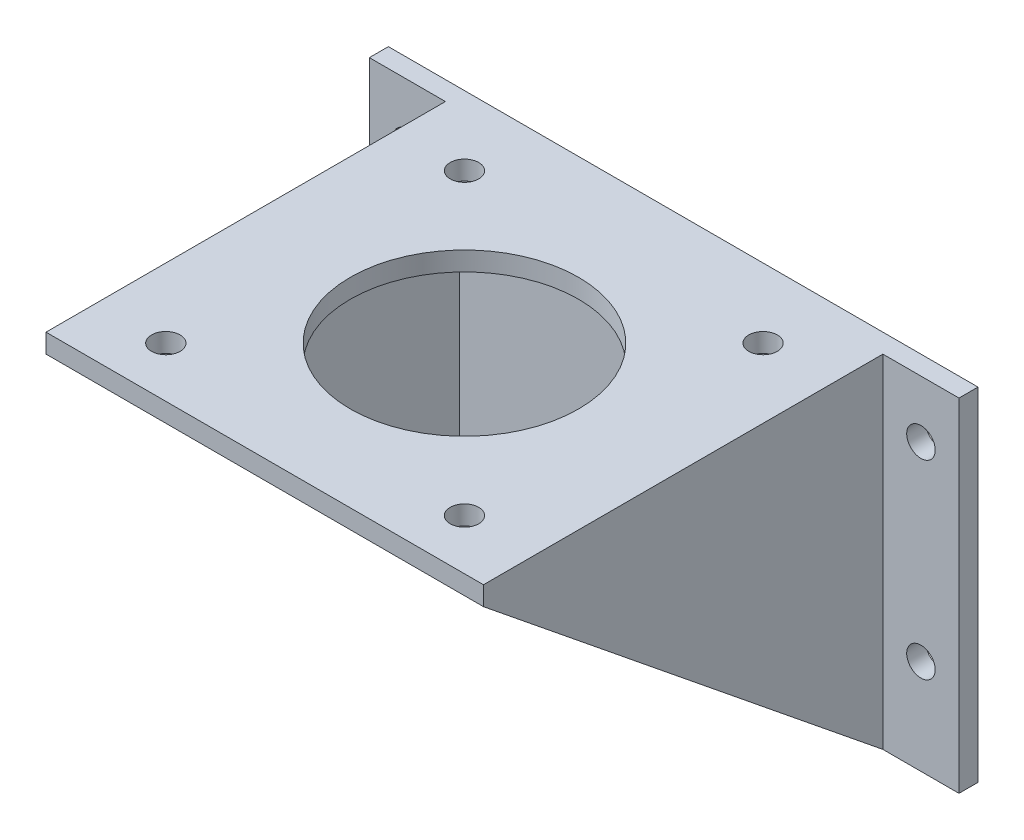
ISO-10303-21;
HEADER;
FILE_DESCRIPTION(('STEP AP214'),'2;1');
FILE_NAME('part.step','',(''),(''),'','','');
FILE_SCHEMA(('AUTOMOTIVE_DESIGN { 1 0 10303 214 1 1 1 1 }'));
ENDSEC;
DATA;
#1=APPLICATION_CONTEXT('core data for automotive mechanical design processes');
#2=APPLICATION_PROTOCOL_DEFINITION('international standard','automotive_design',2000,#1);
#3=PRODUCT_CONTEXT('',#1,'mechanical');
#4=PRODUCT('Part','Part','',(#3));
#5=PRODUCT_RELATED_PRODUCT_CATEGORY('part','',(#4));
#6=PRODUCT_DEFINITION_FORMATION('','',#4);
#7=PRODUCT_DEFINITION_CONTEXT('part definition',#1,'design');
#8=PRODUCT_DEFINITION('design','',#6,#7);
#9=PRODUCT_DEFINITION_SHAPE('','',#8);
#10=(LENGTH_UNIT() NAMED_UNIT(*) SI_UNIT(.MILLI.,.METRE.));
#11=(NAMED_UNIT(*) PLANE_ANGLE_UNIT() SI_UNIT($,.RADIAN.));
#12=(NAMED_UNIT(*) SI_UNIT($,.STERADIAN.) SOLID_ANGLE_UNIT());
#13=UNCERTAINTY_MEASURE_WITH_UNIT(LENGTH_MEASURE(1.E-05),#10,'distance_accuracy_value','');
#14=(GEOMETRIC_REPRESENTATION_CONTEXT(3) GLOBAL_UNCERTAINTY_ASSIGNED_CONTEXT((#13)) GLOBAL_UNIT_ASSIGNED_CONTEXT((#10,
#11,#12)) REPRESENTATION_CONTEXT('',''));
#15=CARTESIAN_POINT('',(0.,0.,0.));
#16=DIRECTION('',(0.,0.,1.));
#17=DIRECTION('',(1.,0.,0.));
#18=AXIS2_PLACEMENT_3D('',#15,#16,#17);
#19=CARTESIAN_POINT('',(0.,0.,2.));
#20=DIRECTION('',(0.,0.,1.));
#21=DIRECTION('',(1.,0.,0.));
#22=AXIS2_PLACEMENT_3D('',#19,#20,#21);
#23=PLANE('',#22);
#24=CARTESIAN_POINT('',(27.,14.,2.));
#25=DIRECTION('',(0.,0.,1.));
#26=DIRECTION('',(1.,0.,0.));
#27=AXIS2_PLACEMENT_3D('',#24,#25,#26);
#28=CIRCLE('',#27,1.5);
#29=CARTESIAN_POINT('',(28.5,14.,2.));
#30=VERTEX_POINT('',#29);
#31=EDGE_CURVE('P0_E10',#30,#30,#28,.T.);
#32=ORIENTED_EDGE('',*,*,#31,.F.);
#33=EDGE_LOOP('',(#32));
#34=FACE_BOUND('',#33,.T.);
#35=CARTESIAN_POINT('',(27.,-6.000008,2.));
#36=DIRECTION('',(0.,0.,1.));
#37=DIRECTION('',(1.,0.,0.));
#38=AXIS2_PLACEMENT_3D('',#35,#36,#37);
#39=CIRCLE('',#38,1.5);
#40=CARTESIAN_POINT('',(28.5,-6.000008,2.));
#41=VERTEX_POINT('',#40);
#42=EDGE_CURVE('P0_E24',#41,#41,#39,.T.);
#43=ORIENTED_EDGE('',*,*,#42,.F.);
#44=EDGE_LOOP('',(#43));
#45=FACE_BOUND('',#44,.T.);
#46=DIRECTION('',(0.,1.,0.));
#47=VECTOR('',#46,1.);
#48=CARTESIAN_POINT('',(23.,19.,2.));
#49=LINE('',#48,#47);
#50=CARTESIAN_POINT('',(23.,-16.000008,2.));
#51=VERTEX_POINT('',#50);
#52=CARTESIAN_POINT('',(23.,20.,2.));
#53=VERTEX_POINT('',#52);
#54=EDGE_CURVE('P0_E31',#51,#53,#49,.T.);
#55=ORIENTED_EDGE('',*,*,#54,.F.);
#56=DIRECTION('',(-1.,0.,0.));
#57=VECTOR('',#56,1.);
#58=CARTESIAN_POINT('',(0.,-16.000008,2.));
#59=LINE('',#58,#57);
#60=CARTESIAN_POINT('',(31.,-16.000008,2.));
#61=VERTEX_POINT('',#60);
#62=EDGE_CURVE('P0_E36',#61,#51,#59,.T.);
#63=ORIENTED_EDGE('',*,*,#62,.F.);
#64=DIRECTION('',(0.,-1.,0.));
#65=VECTOR('',#64,1.);
#66=CARTESIAN_POINT('',(31.,0.,2.));
#67=LINE('',#66,#65);
#68=CARTESIAN_POINT('',(31.,20.,2.));
#69=VERTEX_POINT('',#68);
#70=EDGE_CURVE('P0_E231',#69,#61,#67,.T.);
#71=ORIENTED_EDGE('',*,*,#70,.F.);
#72=DIRECTION('',(-1.,0.,0.));
#73=VECTOR('',#72,1.);
#74=CARTESIAN_POINT('',(0.,20.,2.));
#75=LINE('',#74,#73);
#76=EDGE_CURVE('P0_E228',#69,#53,#75,.T.);
#77=ORIENTED_EDGE('',*,*,#76,.T.);
#78=EDGE_LOOP('',(#55,#63,#71,#77));
#79=FACE_BOUND('',#78,.T.);
#80=ADVANCED_FACE('P0_F16',(#34,#45,#79),#23,.T.);
#81=CARTESIAN_POINT('',(0.,18.,44.));
#82=DIRECTION('',(0.,1.,0.));
#83=DIRECTION('',(-1.,0.,0.));
#84=AXIS2_PLACEMENT_3D('',#81,#82,#83);
#85=PLANE('',#84);
#86=CARTESIAN_POINT('',(0.,18.,23.));
#87=DIRECTION('',(0.,-1.,0.));
#88=DIRECTION('',(1.,0.,0.));
#89=AXIS2_PLACEMENT_3D('',#86,#87,#88);
#90=CIRCLE('',#89,12.);
#91=CARTESIAN_POINT('',(12.,18.,23.));
#92=VERTEX_POINT('',#91);
#93=EDGE_CURVE('P0_E225',#92,#92,#90,.T.);
#94=ORIENTED_EDGE('',*,*,#93,.F.);
#95=EDGE_LOOP('',(#94));
#96=FACE_BOUND('',#95,.T.);
#97=CARTESIAN_POINT('',(15.7,18.,38.7));
#98=DIRECTION('',(0.,-1.,0.));
#99=DIRECTION('',(1.,0.,0.));
#100=AXIS2_PLACEMENT_3D('',#97,#98,#99);
#101=CIRCLE('',#100,1.5);
#102=CARTESIAN_POINT('',(17.2,18.,38.7));
#103=VERTEX_POINT('',#102);
#104=EDGE_CURVE('P0_E222',#103,#103,#101,.T.);
#105=ORIENTED_EDGE('',*,*,#104,.F.);
#106=EDGE_LOOP('',(#105));
#107=FACE_BOUND('',#106,.T.);
#108=CARTESIAN_POINT('',(-15.7,18.,38.7));
#109=DIRECTION('',(0.,-1.,0.));
#110=DIRECTION('',(1.,0.,0.));
#111=AXIS2_PLACEMENT_3D('',#108,#109,#110);
#112=CIRCLE('',#111,1.5);
#113=CARTESIAN_POINT('',(-14.2,18.,38.7));
#114=VERTEX_POINT('',#113);
#115=EDGE_CURVE('P0_E219',#114,#114,#112,.T.);
#116=ORIENTED_EDGE('',*,*,#115,.F.);
#117=EDGE_LOOP('',(#116));
#118=FACE_BOUND('',#117,.T.);
#119=CARTESIAN_POINT('',(-15.7,18.,7.3));
#120=DIRECTION('',(0.,-1.,0.));
#121=DIRECTION('',(1.,0.,0.));
#122=AXIS2_PLACEMENT_3D('',#119,#120,#121);
#123=CIRCLE('',#122,1.5);
#124=CARTESIAN_POINT('',(-14.2,18.,7.3));
#125=VERTEX_POINT('',#124);
#126=EDGE_CURVE('P0_E216',#125,#125,#123,.T.);
#127=ORIENTED_EDGE('',*,*,#126,.F.);
#128=EDGE_LOOP('',(#127));
#129=FACE_BOUND('',#128,.T.);
#130=CARTESIAN_POINT('',(15.7,18.,7.3));
#131=DIRECTION('',(0.,-1.,0.));
#132=DIRECTION('',(1.,0.,0.));
#133=AXIS2_PLACEMENT_3D('',#130,#131,#132);
#134=CIRCLE('',#133,1.5);
#135=CARTESIAN_POINT('',(17.2,18.,7.3));
#136=VERTEX_POINT('',#135);
#137=EDGE_CURVE('P0_E213',#136,#136,#134,.T.);
#138=ORIENTED_EDGE('',*,*,#137,.F.);
#139=EDGE_LOOP('',(#138));
#140=FACE_BOUND('',#139,.T.);
#141=DIRECTION('',(0.,0.,-1.));
#142=VECTOR('',#141,1.);
#143=CARTESIAN_POINT('',(21.5,18.,44.));
#144=LINE('',#143,#142);
#145=CARTESIAN_POINT('',(21.5,18.,44.));
#146=VERTEX_POINT('',#145);
#147=CARTESIAN_POINT('',(21.5,18.,2.));
#148=VERTEX_POINT('',#147);
#149=EDGE_CURVE('P0_E210',#146,#148,#144,.T.);
#150=ORIENTED_EDGE('',*,*,#149,.F.);
#151=DIRECTION('',(1.,0.,0.));
#152=VECTOR('',#151,1.);
#153=CARTESIAN_POINT('',(0.,18.,44.));
#154=LINE('',#153,#152);
#155=CARTESIAN_POINT('',(-21.5,18.,44.));
#156=VERTEX_POINT('',#155);
#157=EDGE_CURVE('P0_E114',#156,#146,#154,.T.);
#158=ORIENTED_EDGE('',*,*,#157,.F.);
#159=DIRECTION('',(0.,0.,-1.));
#160=VECTOR('',#159,1.);
#161=CARTESIAN_POINT('',(-21.5,18.,44.));
#162=LINE('',#161,#160);
#163=CARTESIAN_POINT('',(-21.5,18.,2.));
#164=VERTEX_POINT('',#163);
#165=EDGE_CURVE('P0_E208',#156,#164,#162,.T.);
#166=ORIENTED_EDGE('',*,*,#165,.T.);
#167=DIRECTION('',(1.,0.,0.));
#168=VECTOR('',#167,1.);
#169=CARTESIAN_POINT('',(0.,18.,2.));
#170=LINE('',#169,#168);
#171=EDGE_CURVE('P0_E206',#164,#148,#170,.T.);
#172=ORIENTED_EDGE('',*,*,#171,.T.);
#173=EDGE_LOOP('',(#150,#158,#166,#172));
#174=FACE_BOUND('',#173,.T.);
#175=ADVANCED_FACE('P0_F242',(#96,#107,#118,#129,#140,#174),#85,.F.);
#176=DIRECTION('',(0.,-1.,0.));
#177=VECTOR('',#176,1.);
#178=CARTESIAN_POINT('',(21.5,0.999996,2.));
#179=LINE('',#178,#177);
#180=CARTESIAN_POINT('',(21.5,-16.000008,2.));
#181=VERTEX_POINT('',#180);
#182=EDGE_CURVE('P0_E203',#148,#181,#179,.T.);
#183=ORIENTED_EDGE('',*,*,#182,.F.);
#184=ORIENTED_EDGE('',*,*,#171,.F.);
#185=DIRECTION('',(0.,-1.,0.));
#186=VECTOR('',#185,1.);
#187=CARTESIAN_POINT('',(-21.5,0.999996,2.));
#188=LINE('',#187,#186);
#189=CARTESIAN_POINT('',(-21.5,-16.000008,2.));
#190=VERTEX_POINT('',#189);
#191=EDGE_CURVE('P0_E201',#164,#190,#188,.T.);
#192=ORIENTED_EDGE('',*,*,#191,.T.);
#193=EDGE_CURVE('P0_E200',#181,#190,#59,.T.);
#194=ORIENTED_EDGE('',*,*,#193,.F.);
#195=EDGE_LOOP('',(#183,#184,#192,#194));
#196=FACE_BOUND('',#195,.T.);
#197=ADVANCED_FACE('P0_F244',(#196),#23,.T.);
#198=CARTESIAN_POINT('',(31.,0.,2.));
#199=DIRECTION('',(1.,0.,0.));
#200=DIRECTION('',(0.,1.,0.));
#201=AXIS2_PLACEMENT_3D('',#198,#199,#200);
#202=PLANE('',#201);
#203=ORIENTED_EDGE('',*,*,#70,.T.);
#204=DIRECTION('',(0.,0.,-1.));
#205=VECTOR('',#204,1.);
#206=CARTESIAN_POINT('',(31.,-16.000008,2.));
#207=LINE('',#206,#205);
#208=CARTESIAN_POINT('',(31.,-16.000008,0.));
#209=VERTEX_POINT('',#208);
#210=EDGE_CURVE('P0_E198',#61,#209,#207,.T.);
#211=ORIENTED_EDGE('',*,*,#210,.T.);
#212=DIRECTION('',(0.,-1.,0.));
#213=VECTOR('',#212,1.);
#214=CARTESIAN_POINT('',(31.,0.,0.));
#215=LINE('',#214,#213);
#216=CARTESIAN_POINT('',(31.,20.,0.));
#217=VERTEX_POINT('',#216);
#218=EDGE_CURVE('P0_E195',#217,#209,#215,.T.);
#219=ORIENTED_EDGE('',*,*,#218,.F.);
#220=DIRECTION('',(0.,0.,-1.));
#221=VECTOR('',#220,1.);
#222=CARTESIAN_POINT('',(31.,20.,2.));
#223=LINE('',#222,#221);
#224=EDGE_CURVE('P0_E192',#69,#217,#223,.T.);
#225=ORIENTED_EDGE('',*,*,#224,.F.);
#226=EDGE_LOOP('',(#203,#211,#219,#225));
#227=FACE_BOUND('',#226,.T.);
#228=ADVANCED_FACE('P0_F252',(#227),#202,.T.);
#229=CARTESIAN_POINT('',(-31.,0.,2.));
#230=DIRECTION('',(1.,0.,0.));
#231=DIRECTION('',(0.,1.,0.));
#232=AXIS2_PLACEMENT_3D('',#229,#230,#231);
#233=PLANE('',#232);
#234=DIRECTION('',(0.,0.,-1.));
#235=VECTOR('',#234,1.);
#236=CARTESIAN_POINT('',(-31.,-16.000008,2.));
#237=LINE('',#236,#235);
#238=CARTESIAN_POINT('',(-31.,-16.000008,2.));
#239=VERTEX_POINT('',#238);
#240=CARTESIAN_POINT('',(-31.,-16.000008,0.));
#241=VERTEX_POINT('',#240);
#242=EDGE_CURVE('P0_E189',#239,#241,#237,.T.);
#243=ORIENTED_EDGE('',*,*,#242,.F.);
#244=DIRECTION('',(0.,-1.,0.));
#245=VECTOR('',#244,1.);
#246=CARTESIAN_POINT('',(-31.,0.,2.));
#247=LINE('',#246,#245);
#248=CARTESIAN_POINT('',(-31.,20.,2.));
#249=VERTEX_POINT('',#248);
#250=EDGE_CURVE('P0_E186',#249,#239,#247,.T.);
#251=ORIENTED_EDGE('',*,*,#250,.F.);
#252=DIRECTION('',(0.,0.,-1.));
#253=VECTOR('',#252,1.);
#254=CARTESIAN_POINT('',(-31.,20.,2.));
#255=LINE('',#254,#253);
#256=CARTESIAN_POINT('',(-31.,20.,0.));
#257=VERTEX_POINT('',#256);
#258=EDGE_CURVE('P0_E184',#249,#257,#255,.T.);
#259=ORIENTED_EDGE('',*,*,#258,.T.);
#260=DIRECTION('',(0.,-1.,0.));
#261=VECTOR('',#260,1.);
#262=CARTESIAN_POINT('',(-31.,0.,0.));
#263=LINE('',#262,#261);
#264=EDGE_CURVE('P0_E182',#257,#241,#263,.T.);
#265=ORIENTED_EDGE('',*,*,#264,.T.);
#266=EDGE_LOOP('',(#243,#251,#259,#265));
#267=FACE_BOUND('',#266,.T.);
#268=ADVANCED_FACE('P0_F266',(#267),#233,.F.);
#269=CARTESIAN_POINT('',(0.,20.,2.));
#270=DIRECTION('',(0.,-1.,0.));
#271=DIRECTION('',(0.,0.,-1.));
#272=AXIS2_PLACEMENT_3D('',#269,#270,#271);
#273=PLANE('',#272);
#274=CARTESIAN_POINT('',(15.7,20.,7.3));
#275=DIRECTION('',(0.,-1.,0.));
#276=DIRECTION('',(0.,0.,-1.));
#277=AXIS2_PLACEMENT_3D('',#274,#275,#276);
#278=CIRCLE('',#277,1.5);
#279=CARTESIAN_POINT('',(15.7,20.,5.8));
#280=VERTEX_POINT('',#279);
#281=EDGE_CURVE('P0_E179',#280,#280,#278,.T.);
#282=ORIENTED_EDGE('',*,*,#281,.T.);
#283=EDGE_LOOP('',(#282));
#284=FACE_BOUND('',#283,.T.);
#285=CARTESIAN_POINT('',(-15.7,20.,7.3));
#286=DIRECTION('',(0.,-1.,0.));
#287=DIRECTION('',(0.,0.,-1.));
#288=AXIS2_PLACEMENT_3D('',#285,#286,#287);
#289=CIRCLE('',#288,1.5);
#290=CARTESIAN_POINT('',(-15.7,20.,5.8));
#291=VERTEX_POINT('',#290);
#292=EDGE_CURVE('P0_E176',#291,#291,#289,.T.);
#293=ORIENTED_EDGE('',*,*,#292,.T.);
#294=EDGE_LOOP('',(#293));
#295=FACE_BOUND('',#294,.T.);
#296=CARTESIAN_POINT('',(-15.7,20.,38.7));
#297=DIRECTION('',(0.,-1.,0.));
#298=DIRECTION('',(0.,0.,-1.));
#299=AXIS2_PLACEMENT_3D('',#296,#297,#298);
#300=CIRCLE('',#299,1.5);
#301=CARTESIAN_POINT('',(-15.7,20.,37.2));
#302=VERTEX_POINT('',#301);
#303=EDGE_CURVE('P0_E173',#302,#302,#300,.T.);
#304=ORIENTED_EDGE('',*,*,#303,.T.);
#305=EDGE_LOOP('',(#304));
#306=FACE_BOUND('',#305,.T.);
#307=CARTESIAN_POINT('',(15.7,20.,38.7));
#308=DIRECTION('',(0.,-1.,0.));
#309=DIRECTION('',(0.,0.,-1.));
#310=AXIS2_PLACEMENT_3D('',#307,#308,#309);
#311=CIRCLE('',#310,1.5);
#312=CARTESIAN_POINT('',(15.7,20.,37.2));
#313=VERTEX_POINT('',#312);
#314=EDGE_CURVE('P0_E170',#313,#313,#311,.T.);
#315=ORIENTED_EDGE('',*,*,#314,.T.);
#316=EDGE_LOOP('',(#315));
#317=FACE_BOUND('',#316,.T.);
#318=CARTESIAN_POINT('',(0.,20.,23.));
#319=DIRECTION('',(0.,-1.,0.));
#320=DIRECTION('',(0.,0.,-1.));
#321=AXIS2_PLACEMENT_3D('',#318,#319,#320);
#322=CIRCLE('',#321,12.);
#323=CARTESIAN_POINT('',(0.,20.,11.));
#324=VERTEX_POINT('',#323);
#325=EDGE_CURVE('P0_E167',#324,#324,#322,.T.);
#326=ORIENTED_EDGE('',*,*,#325,.T.);
#327=EDGE_LOOP('',(#326));
#328=FACE_BOUND('',#327,.T.);
#329=DIRECTION('',(-1.,0.,0.));
#330=VECTOR('',#329,1.);
#331=CARTESIAN_POINT('',(0.,20.,0.));
#332=LINE('',#331,#330);
#333=EDGE_CURVE('P0_E164',#217,#257,#332,.T.);
#334=ORIENTED_EDGE('',*,*,#333,.T.);
#335=ORIENTED_EDGE('',*,*,#258,.F.);
#336=CARTESIAN_POINT('',(-23.,20.,2.));
#337=VERTEX_POINT('',#336);
#338=EDGE_CURVE('P0_E163',#337,#249,#75,.T.);
#339=ORIENTED_EDGE('',*,*,#338,.F.);
#340=DIRECTION('',(0.,0.,-1.));
#341=VECTOR('',#340,1.);
#342=CARTESIAN_POINT('',(-23.,20.,44.));
#343=LINE('',#342,#341);
#344=CARTESIAN_POINT('',(-23.,20.,44.));
#345=VERTEX_POINT('',#344);
#346=EDGE_CURVE('P0_E160',#345,#337,#343,.T.);
#347=ORIENTED_EDGE('',*,*,#346,.F.);
#348=DIRECTION('',(-1.,0.,0.));
#349=VECTOR('',#348,1.);
#350=CARTESIAN_POINT('',(0.,20.,44.));
#351=LINE('',#350,#349);
#352=CARTESIAN_POINT('',(23.,20.,44.));
#353=VERTEX_POINT('',#352);
#354=EDGE_CURVE('P0_E158',#353,#345,#351,.T.);
#355=ORIENTED_EDGE('',*,*,#354,.F.);
#356=DIRECTION('',(0.,0.,-1.));
#357=VECTOR('',#356,1.);
#358=CARTESIAN_POINT('',(23.,20.,44.));
#359=LINE('',#358,#357);
#360=EDGE_CURVE('P0_E104',#353,#53,#359,.T.);
#361=ORIENTED_EDGE('',*,*,#360,.T.);
#362=ORIENTED_EDGE('',*,*,#76,.F.);
#363=ORIENTED_EDGE('',*,*,#224,.T.);
#364=EDGE_LOOP('',(#334,#335,#339,#347,#355,#361,#362,#363));
#365=FACE_BOUND('',#364,.T.);
#366=ADVANCED_FACE('P0_F256',(#284,#295,#306,#317,#328,#365),#273,.F.);
#367=CARTESIAN_POINT('',(-27.,14.,2.));
#368=DIRECTION('',(0.,0.,1.));
#369=DIRECTION('',(1.,0.,0.));
#370=AXIS2_PLACEMENT_3D('',#367,#368,#369);
#371=CIRCLE('',#370,1.5);
#372=CARTESIAN_POINT('',(-25.5,14.,2.));
#373=VERTEX_POINT('',#372);
#374=EDGE_CURVE('P0_E154',#373,#373,#371,.T.);
#375=ORIENTED_EDGE('',*,*,#374,.F.);
#376=EDGE_LOOP('',(#375));
#377=FACE_BOUND('',#376,.T.);
#378=CARTESIAN_POINT('',(-27.,-6.000008,2.));
#379=DIRECTION('',(0.,0.,1.));
#380=DIRECTION('',(1.,0.,0.));
#381=AXIS2_PLACEMENT_3D('',#378,#379,#380);
#382=CIRCLE('',#381,1.5);
#383=CARTESIAN_POINT('',(-25.5,-6.000008,2.));
#384=VERTEX_POINT('',#383);
#385=EDGE_CURVE('P0_E151',#384,#384,#382,.T.);
#386=ORIENTED_EDGE('',*,*,#385,.F.);
#387=EDGE_LOOP('',(#386));
#388=FACE_BOUND('',#387,.T.);
#389=CARTESIAN_POINT('',(-23.,-16.000008,2.));
#390=VERTEX_POINT('',#389);
#391=EDGE_CURVE('P0_E150',#390,#239,#59,.T.);
#392=ORIENTED_EDGE('',*,*,#391,.F.);
#393=DIRECTION('',(0.,-1.,0.));
#394=VECTOR('',#393,1.);
#395=CARTESIAN_POINT('',(-23.,19.,2.));
#396=LINE('',#395,#394);
#397=EDGE_CURVE('P0_E147',#337,#390,#396,.T.);
#398=ORIENTED_EDGE('',*,*,#397,.F.);
#399=ORIENTED_EDGE('',*,*,#338,.T.);
#400=ORIENTED_EDGE('',*,*,#250,.T.);
#401=EDGE_LOOP('',(#392,#398,#399,#400));
#402=FACE_BOUND('',#401,.T.);
#403=ADVANCED_FACE('P0_F18',(#377,#388,#402),#23,.T.);
#404=CARTESIAN_POINT('',(0.,0.,0.));
#405=DIRECTION('',(0.,0.,1.));
#406=DIRECTION('',(1.,0.,0.));
#407=AXIS2_PLACEMENT_3D('',#404,#405,#406);
#408=PLANE('',#407);
#409=CARTESIAN_POINT('',(-27.,14.,0.));
#410=DIRECTION('',(0.,0.,1.));
#411=DIRECTION('',(1.,0.,0.));
#412=AXIS2_PLACEMENT_3D('',#409,#410,#411);
#413=CIRCLE('',#412,1.5);
#414=CARTESIAN_POINT('',(-25.5,14.,0.));
#415=VERTEX_POINT('',#414);
#416=EDGE_CURVE('P0_E144',#415,#415,#413,.T.);
#417=ORIENTED_EDGE('',*,*,#416,.T.);
#418=EDGE_LOOP('',(#417));
#419=FACE_BOUND('',#418,.T.);
#420=CARTESIAN_POINT('',(27.,14.,0.));
#421=DIRECTION('',(0.,0.,1.));
#422=DIRECTION('',(1.,0.,0.));
#423=AXIS2_PLACEMENT_3D('',#420,#421,#422);
#424=CIRCLE('',#423,1.5);
#425=CARTESIAN_POINT('',(28.5,14.,0.));
#426=VERTEX_POINT('',#425);
#427=EDGE_CURVE('P0_E141',#426,#426,#424,.T.);
#428=ORIENTED_EDGE('',*,*,#427,.T.);
#429=EDGE_LOOP('',(#428));
#430=FACE_BOUND('',#429,.T.);
#431=CARTESIAN_POINT('',(27.,-6.000008,0.));
#432=DIRECTION('',(0.,0.,1.));
#433=DIRECTION('',(1.,0.,0.));
#434=AXIS2_PLACEMENT_3D('',#431,#432,#433);
#435=CIRCLE('',#434,1.5);
#436=CARTESIAN_POINT('',(28.5,-6.000008,0.));
#437=VERTEX_POINT('',#436);
#438=EDGE_CURVE('P0_E138',#437,#437,#435,.T.);
#439=ORIENTED_EDGE('',*,*,#438,.T.);
#440=EDGE_LOOP('',(#439));
#441=FACE_BOUND('',#440,.T.);
#442=CARTESIAN_POINT('',(-27.,-6.000008,0.));
#443=DIRECTION('',(0.,0.,1.));
#444=DIRECTION('',(1.,0.,0.));
#445=AXIS2_PLACEMENT_3D('',#442,#443,#444);
#446=CIRCLE('',#445,1.5);
#447=CARTESIAN_POINT('',(-25.5,-6.000008,0.));
#448=VERTEX_POINT('',#447);
#449=EDGE_CURVE('P0_E135',#448,#448,#446,.T.);
#450=ORIENTED_EDGE('',*,*,#449,.T.);
#451=EDGE_LOOP('',(#450));
#452=FACE_BOUND('',#451,.T.);
#453=ORIENTED_EDGE('',*,*,#218,.T.);
#454=DIRECTION('',(-1.,0.,0.));
#455=VECTOR('',#454,1.);
#456=CARTESIAN_POINT('',(0.,-16.000008,0.));
#457=LINE('',#456,#455);
#458=EDGE_CURVE('P0_E132',#209,#241,#457,.T.);
#459=ORIENTED_EDGE('',*,*,#458,.T.);
#460=ORIENTED_EDGE('',*,*,#264,.F.);
#461=ORIENTED_EDGE('',*,*,#333,.F.);
#462=EDGE_LOOP('',(#453,#459,#460,#461));
#463=FACE_BOUND('',#462,.T.);
#464=ADVANCED_FACE('P0_F255',(#419,#430,#441,#452,#463),#408,.F.);
#465=CARTESIAN_POINT('',(-23.,19.,44.));
#466=DIRECTION('',(1.,0.,0.));
#467=DIRECTION('',(0.,0.,-1.));
#468=AXIS2_PLACEMENT_3D('',#465,#466,#467);
#469=PLANE('',#468);
#470=ORIENTED_EDGE('',*,*,#397,.T.);
#471=DIRECTION('',(0.,-0.629198318104348,-0.777244798306595));
#472=VECTOR('',#471,1.);
#473=CARTESIAN_POINT('',(-23.,0.999996,23.));
#474=LINE('',#473,#472);
#475=CARTESIAN_POINT('',(-23.,18.,44.));
#476=VERTEX_POINT('',#475);
#477=EDGE_CURVE('P0_E130',#390,#476,#474,.F.);
#478=ORIENTED_EDGE('',*,*,#477,.T.);
#479=DIRECTION('',(0.,-1.,0.));
#480=VECTOR('',#479,1.);
#481=CARTESIAN_POINT('',(-23.,19.,44.));
#482=LINE('',#481,#480);
#483=EDGE_CURVE('P0_E107',#345,#476,#482,.T.);
#484=ORIENTED_EDGE('',*,*,#483,.F.);
#485=ORIENTED_EDGE('',*,*,#346,.T.);
#486=EDGE_LOOP('',(#470,#478,#484,#485));
#487=FACE_BOUND('',#486,.T.);
#488=ADVANCED_FACE('P0_F263',(#487),#469,.F.);
#489=CARTESIAN_POINT('',(23.,19.,44.));
#490=DIRECTION('',(-1.,0.,0.));
#491=DIRECTION('',(0.,0.,1.));
#492=AXIS2_PLACEMENT_3D('',#489,#490,#491);
#493=PLANE('',#492);
#494=ORIENTED_EDGE('',*,*,#54,.T.);
#495=ORIENTED_EDGE('',*,*,#360,.F.);
#496=DIRECTION('',(0.,1.,0.));
#497=VECTOR('',#496,1.);
#498=CARTESIAN_POINT('',(23.,19.,44.));
#499=LINE('',#498,#497);
#500=CARTESIAN_POINT('',(23.,18.,44.));
#501=VERTEX_POINT('',#500);
#502=EDGE_CURVE('P0_E98',#501,#353,#499,.T.);
#503=ORIENTED_EDGE('',*,*,#502,.F.);
#504=DIRECTION('',(0.,-0.629198318104348,-0.777244798306595));
#505=VECTOR('',#504,1.);
#506=CARTESIAN_POINT('',(23.,0.999996,23.));
#507=LINE('',#506,#505);
#508=EDGE_CURVE('P0_E102',#51,#501,#507,.F.);
#509=ORIENTED_EDGE('',*,*,#508,.F.);
#510=EDGE_LOOP('',(#494,#495,#503,#509));
#511=FACE_BOUND('',#510,.T.);
#512=ADVANCED_FACE('P0_F100',(#511),#493,.F.);
#513=CARTESIAN_POINT('',(0.,0.,44.));
#514=DIRECTION('',(0.,0.,1.));
#515=DIRECTION('',(1.,0.,0.));
#516=AXIS2_PLACEMENT_3D('',#513,#514,#515);
#517=PLANE('',#516);
#518=ORIENTED_EDGE('',*,*,#354,.T.);
#519=ORIENTED_EDGE('',*,*,#483,.T.);
#520=EDGE_CURVE('P0_E118',#476,#156,#154,.T.);
#521=ORIENTED_EDGE('',*,*,#520,.T.);
#522=ORIENTED_EDGE('',*,*,#157,.T.);
#523=DIRECTION('',(1.,0.,0.));
#524=VECTOR('',#523,1.);
#525=CARTESIAN_POINT('',(21.5,18.,44.));
#526=LINE('',#525,#524);
#527=EDGE_CURVE('P0_E111',#146,#501,#526,.T.);
#528=ORIENTED_EDGE('',*,*,#527,.T.);
#529=ORIENTED_EDGE('',*,*,#502,.T.);
#530=EDGE_LOOP('',(#518,#519,#521,#522,#528,#529));
#531=FACE_BOUND('',#530,.T.);
#532=ADVANCED_FACE('P0_F112',(#531),#517,.T.);
#533=CARTESIAN_POINT('',(0.,43.,23.));
#534=DIRECTION('',(0.,-1.,0.));
#535=DIRECTION('',(1.,0.,0.));
#536=AXIS2_PLACEMENT_3D('',#533,#534,#535);
#537=CYLINDRICAL_SURFACE('',#536,12.);
#538=ORIENTED_EDGE('',*,*,#93,.T.);
#539=EDGE_LOOP('',(#538));
#540=FACE_BOUND('',#539,.T.);
#541=ORIENTED_EDGE('',*,*,#325,.F.);
#542=EDGE_LOOP('',(#541));
#543=FACE_BOUND('',#542,.T.);
#544=ADVANCED_FACE('P0_F315',(#540,#543),#537,.F.);
#545=CARTESIAN_POINT('',(15.7,43.,38.7));
#546=DIRECTION('',(0.,-1.,0.));
#547=DIRECTION('',(1.,0.,0.));
#548=AXIS2_PLACEMENT_3D('',#545,#546,#547);
#549=CYLINDRICAL_SURFACE('',#548,1.5);
#550=ORIENTED_EDGE('',*,*,#104,.T.);
#551=EDGE_LOOP('',(#550));
#552=FACE_BOUND('',#551,.T.);
#553=ORIENTED_EDGE('',*,*,#314,.F.);
#554=EDGE_LOOP('',(#553));
#555=FACE_BOUND('',#554,.T.);
#556=ADVANCED_FACE('P0_F318',(#552,#555),#549,.F.);
#557=CARTESIAN_POINT('',(-15.7,43.,38.7));
#558=DIRECTION('',(0.,-1.,0.));
#559=DIRECTION('',(1.,0.,0.));
#560=AXIS2_PLACEMENT_3D('',#557,#558,#559);
#561=CYLINDRICAL_SURFACE('',#560,1.5);
#562=ORIENTED_EDGE('',*,*,#115,.T.);
#563=EDGE_LOOP('',(#562));
#564=FACE_BOUND('',#563,.T.);
#565=ORIENTED_EDGE('',*,*,#303,.F.);
#566=EDGE_LOOP('',(#565));
#567=FACE_BOUND('',#566,.T.);
#568=ADVANCED_FACE('P0_F322',(#564,#567),#561,.F.);
#569=CARTESIAN_POINT('',(-15.7,43.,7.3));
#570=DIRECTION('',(0.,-1.,0.));
#571=DIRECTION('',(1.,0.,0.));
#572=AXIS2_PLACEMENT_3D('',#569,#570,#571);
#573=CYLINDRICAL_SURFACE('',#572,1.5);
#574=ORIENTED_EDGE('',*,*,#126,.T.);
#575=EDGE_LOOP('',(#574));
#576=FACE_BOUND('',#575,.T.);
#577=ORIENTED_EDGE('',*,*,#292,.F.);
#578=EDGE_LOOP('',(#577));
#579=FACE_BOUND('',#578,.T.);
#580=ADVANCED_FACE('P0_F326',(#576,#579),#573,.F.);
#581=CARTESIAN_POINT('',(15.7,43.,7.3));
#582=DIRECTION('',(0.,-1.,0.));
#583=DIRECTION('',(1.,0.,0.));
#584=AXIS2_PLACEMENT_3D('',#581,#582,#583);
#585=CYLINDRICAL_SURFACE('',#584,1.5);
#586=ORIENTED_EDGE('',*,*,#137,.T.);
#587=EDGE_LOOP('',(#586));
#588=FACE_BOUND('',#587,.T.);
#589=ORIENTED_EDGE('',*,*,#281,.F.);
#590=EDGE_LOOP('',(#589));
#591=FACE_BOUND('',#590,.T.);
#592=ADVANCED_FACE('P0_F330',(#588,#591),#585,.F.);
#593=CARTESIAN_POINT('',(0.,-16.000008,2.));
#594=DIRECTION('',(0.,-1.,0.));
#595=DIRECTION('',(0.,0.,-1.));
#596=AXIS2_PLACEMENT_3D('',#593,#594,#595);
#597=PLANE('',#596);
#598=ORIENTED_EDGE('',*,*,#458,.F.);
#599=ORIENTED_EDGE('',*,*,#210,.F.);
#600=ORIENTED_EDGE('',*,*,#62,.T.);
#601=DIRECTION('',(1.,0.,0.));
#602=VECTOR('',#601,1.);
#603=CARTESIAN_POINT('',(21.5,-16.000008,2.));
#604=LINE('',#603,#602);
#605=EDGE_CURVE('P0_E119',#181,#51,#604,.T.);
#606=ORIENTED_EDGE('',*,*,#605,.F.);
#607=ORIENTED_EDGE('',*,*,#193,.T.);
#608=DIRECTION('',(-1.,0.,0.));
#609=VECTOR('',#608,1.);
#610=CARTESIAN_POINT('',(-21.5,-16.000008,2.));
#611=LINE('',#610,#609);
#612=EDGE_CURVE('P0_E281',#190,#390,#611,.T.);
#613=ORIENTED_EDGE('',*,*,#612,.T.);
#614=ORIENTED_EDGE('',*,*,#391,.T.);
#615=ORIENTED_EDGE('',*,*,#242,.T.);
#616=EDGE_LOOP('',(#598,#599,#600,#606,#607,#613,#614,#615));
#617=FACE_BOUND('',#616,.T.);
#618=ADVANCED_FACE('P0_F283',(#617),#597,.T.);
#619=CARTESIAN_POINT('',(-21.5,0.999996,23.));
#620=DIRECTION('',(0.,-0.777244798306595,0.629198318104348));
#621=DIRECTION('',(0.,-0.629198318104348,-0.777244798306595));
#622=AXIS2_PLACEMENT_3D('',#619,#620,#621);
#623=PLANE('',#622);
#624=ORIENTED_EDGE('',*,*,#477,.F.);
#625=ORIENTED_EDGE('',*,*,#612,.F.);
#626=DIRECTION('',(0.,-0.629198318104348,-0.777244798306595));
#627=VECTOR('',#626,1.);
#628=CARTESIAN_POINT('',(-21.5,0.999996,23.));
#629=LINE('',#628,#627);
#630=EDGE_CURVE('P0_E287',#190,#156,#629,.F.);
#631=ORIENTED_EDGE('',*,*,#630,.T.);
#632=ORIENTED_EDGE('',*,*,#520,.F.);
#633=EDGE_LOOP('',(#624,#625,#631,#632));
#634=FACE_BOUND('',#633,.T.);
#635=ADVANCED_FACE('P0_F290',(#634),#623,.T.);
#636=CARTESIAN_POINT('',(-21.5,9.499998,12.5));
#637=DIRECTION('',(1.,0.,0.));
#638=DIRECTION('',(0.,0.,-1.));
#639=AXIS2_PLACEMENT_3D('',#636,#637,#638);
#640=PLANE('',#639);
#641=ORIENTED_EDGE('',*,*,#630,.F.);
#642=ORIENTED_EDGE('',*,*,#191,.F.);
#643=ORIENTED_EDGE('',*,*,#165,.F.);
#644=EDGE_LOOP('',(#641,#642,#643));
#645=FACE_BOUND('',#644,.T.);
#646=ADVANCED_FACE('P0_F339',(#645),#640,.T.);
#647=CARTESIAN_POINT('',(21.5,0.999996,23.));
#648=DIRECTION('',(0.,0.777244798306595,-0.629198318104348));
#649=DIRECTION('',(0.,0.629198318104348,0.777244798306595));
#650=AXIS2_PLACEMENT_3D('',#647,#648,#649);
#651=PLANE('',#650);
#652=ORIENTED_EDGE('',*,*,#508,.T.);
#653=ORIENTED_EDGE('',*,*,#527,.F.);
#654=DIRECTION('',(0.,-0.629198318104348,-0.777244798306595));
#655=VECTOR('',#654,1.);
#656=CARTESIAN_POINT('',(21.5,0.999996,23.));
#657=LINE('',#656,#655);
#658=EDGE_CURVE('P0_E525',#181,#146,#657,.F.);
#659=ORIENTED_EDGE('',*,*,#658,.F.);
#660=ORIENTED_EDGE('',*,*,#605,.T.);
#661=EDGE_LOOP('',(#652,#653,#659,#660));
#662=FACE_BOUND('',#661,.T.);
#663=ADVANCED_FACE('P0_F122',(#662),#651,.F.);
#664=CARTESIAN_POINT('',(21.5,9.499998,12.5));
#665=DIRECTION('',(1.,0.,0.));
#666=DIRECTION('',(0.,0.,-1.));
#667=AXIS2_PLACEMENT_3D('',#664,#665,#666);
#668=PLANE('',#667);
#669=ORIENTED_EDGE('',*,*,#658,.T.);
#670=ORIENTED_EDGE('',*,*,#149,.T.);
#671=ORIENTED_EDGE('',*,*,#182,.T.);
#672=EDGE_LOOP('',(#669,#670,#671));
#673=FACE_BOUND('',#672,.T.);
#674=ADVANCED_FACE('P0_F345',(#673),#668,.F.);
#675=CARTESIAN_POINT('',(-27.,-6.000008,-23.));
#676=DIRECTION('',(0.,0.,1.));
#677=DIRECTION('',(1.,0.,0.));
#678=AXIS2_PLACEMENT_3D('',#675,#676,#677);
#679=CYLINDRICAL_SURFACE('',#678,1.5);
#680=ORIENTED_EDGE('',*,*,#385,.T.);
#681=EDGE_LOOP('',(#680));
#682=FACE_BOUND('',#681,.T.);
#683=ORIENTED_EDGE('',*,*,#449,.F.);
#684=EDGE_LOOP('',(#683));
#685=FACE_BOUND('',#684,.T.);
#686=ADVANCED_FACE('P0_F348',(#682,#685),#679,.F.);
#687=CARTESIAN_POINT('',(27.,-6.000008,-23.));
#688=DIRECTION('',(0.,0.,1.));
#689=DIRECTION('',(1.,0.,0.));
#690=AXIS2_PLACEMENT_3D('',#687,#688,#689);
#691=CYLINDRICAL_SURFACE('',#690,1.5);
#692=ORIENTED_EDGE('',*,*,#42,.T.);
#693=EDGE_LOOP('',(#692));
#694=FACE_BOUND('',#693,.T.);
#695=ORIENTED_EDGE('',*,*,#438,.F.);
#696=EDGE_LOOP('',(#695));
#697=FACE_BOUND('',#696,.T.);
#698=ADVANCED_FACE('P0_F238',(#694,#697),#691,.F.);
#699=CARTESIAN_POINT('',(27.,14.,-23.));
#700=DIRECTION('',(0.,0.,1.));
#701=DIRECTION('',(1.,0.,0.));
#702=AXIS2_PLACEMENT_3D('',#699,#700,#701);
#703=CYLINDRICAL_SURFACE('',#702,1.5);
#704=ORIENTED_EDGE('',*,*,#31,.T.);
#705=EDGE_LOOP('',(#704));
#706=FACE_BOUND('',#705,.T.);
#707=ORIENTED_EDGE('',*,*,#427,.F.);
#708=EDGE_LOOP('',(#707));
#709=FACE_BOUND('',#708,.T.);
#710=ADVANCED_FACE('P0_F355',(#706,#709),#703,.F.);
#711=CARTESIAN_POINT('',(-27.,14.,-23.));
#712=DIRECTION('',(0.,0.,1.));
#713=DIRECTION('',(1.,0.,0.));
#714=AXIS2_PLACEMENT_3D('',#711,#712,#713);
#715=CYLINDRICAL_SURFACE('',#714,1.5);
#716=ORIENTED_EDGE('',*,*,#374,.T.);
#717=EDGE_LOOP('',(#716));
#718=FACE_BOUND('',#717,.T.);
#719=ORIENTED_EDGE('',*,*,#416,.F.);
#720=EDGE_LOOP('',(#719));
#721=FACE_BOUND('',#720,.T.);
#722=ADVANCED_FACE('P0_F358',(#718,#721),#715,.F.);
#723=CLOSED_SHELL('',(#80,#175,#197,#228,#268,#366,#403,#464,#488,#512,#532,#544,#556,#568,#580,
#592,#618,#635,#646,#663,#674,#686,#698,#710,#722));
#724=MANIFOLD_SOLID_BREP('P0_B1',#723);
#725=CARTESIAN_POINT('',(-23.,9.499998,12.5));
#726=DIRECTION('',(1.,0.,0.));
#727=DIRECTION('',(0.,0.,-1.));
#728=AXIS2_PLACEMENT_3D('',#725,#726,#727);
#729=PLANE('',#728);
#730=DIRECTION('',(0.,-0.629198318104348,-0.777244798306595));
#731=VECTOR('',#730,1.);
#732=CARTESIAN_POINT('',(-23.,0.999996,23.));
#733=LINE('',#732,#731);
#734=CARTESIAN_POINT('',(-23.,-16.000008,2.));
#735=VERTEX_POINT('',#734);
#736=CARTESIAN_POINT('',(-23.,18.,44.));
#737=VERTEX_POINT('',#736);
#738=EDGE_CURVE('P1_E10',#735,#737,#733,.F.);
#739=ORIENTED_EDGE('',*,*,#738,.T.);
#740=DIRECTION('',(0.,0.,-1.));
#741=VECTOR('',#740,1.);
#742=CARTESIAN_POINT('',(-23.,18.,44.));
#743=LINE('',#742,#741);
#744=CARTESIAN_POINT('',(-23.,18.,2.));
#745=VERTEX_POINT('',#744);
#746=EDGE_CURVE('P1_E20',#737,#745,#743,.T.);
#747=ORIENTED_EDGE('',*,*,#746,.T.);
#748=DIRECTION('',(0.,-1.,0.));
#749=VECTOR('',#748,1.);
#750=CARTESIAN_POINT('',(-23.,0.999996,2.));
#751=LINE('',#750,#749);
#752=EDGE_CURVE('P1_E30',#745,#735,#751,.T.);
#753=ORIENTED_EDGE('',*,*,#752,.T.);
#754=EDGE_LOOP('',(#739,#747,#753));
#755=FACE_BOUND('',#754,.T.);
#756=ADVANCED_FACE('P1_F16',(#755),#729,.F.);
#757=OPEN_SHELL('',(#756));
#758=SHELL_BASED_SURFACE_MODEL('P1_B1',(#757));
#759=CARTESIAN_POINT('',(23.,9.499998,12.5));
#760=DIRECTION('',(1.,0.,0.));
#761=DIRECTION('',(0.,0.,-1.));
#762=AXIS2_PLACEMENT_3D('',#759,#760,#761);
#763=PLANE('',#762);
#764=DIRECTION('',(0.,-0.629198318104348,-0.777244798306595));
#765=VECTOR('',#764,1.);
#766=CARTESIAN_POINT('',(23.,0.999996,23.));
#767=LINE('',#766,#765);
#768=CARTESIAN_POINT('',(23.,-16.000008,2.));
#769=VERTEX_POINT('',#768);
#770=CARTESIAN_POINT('',(23.,18.,44.));
#771=VERTEX_POINT('',#770);
#772=EDGE_CURVE('P2_E11',#769,#771,#767,.F.);
#773=ORIENTED_EDGE('',*,*,#772,.T.);
#774=DIRECTION('',(0.,0.,-1.));
#775=VECTOR('',#774,1.);
#776=CARTESIAN_POINT('',(23.,18.,44.));
#777=LINE('',#776,#775);
#778=CARTESIAN_POINT('',(23.,18.,2.));
#779=VERTEX_POINT('',#778);
#780=EDGE_CURVE('P2_E21',#771,#779,#777,.T.);
#781=ORIENTED_EDGE('',*,*,#780,.T.);
#782=DIRECTION('',(0.,-1.,0.));
#783=VECTOR('',#782,1.);
#784=CARTESIAN_POINT('',(23.,0.999996,2.));
#785=LINE('',#784,#783);
#786=EDGE_CURVE('P2_E31',#779,#769,#785,.T.);
#787=ORIENTED_EDGE('',*,*,#786,.T.);
#788=EDGE_LOOP('',(#773,#781,#787));
#789=FACE_BOUND('',#788,.T.);
#790=ADVANCED_FACE('P2_F17',(#789),#763,.F.);
#791=OPEN_SHELL('',(#790));
#792=SHELL_BASED_SURFACE_MODEL('P2_B1',(#791));
#793=ADVANCED_BREP_SHAPE_REPRESENTATION('',(#18,#724),#14);
#794=MANIFOLD_SURFACE_SHAPE_REPRESENTATION('',(#18,#758,#792),#14);
#795=SHAPE_REPRESENTATION('',(#18),#14);
#796=SHAPE_DEFINITION_REPRESENTATION(#9,#795);
#797=SHAPE_REPRESENTATION_RELATIONSHIP('','',#795,#793);
#798=SHAPE_REPRESENTATION_RELATIONSHIP('','',#795,#794);
ENDSEC;
END-ISO-10303-21;
